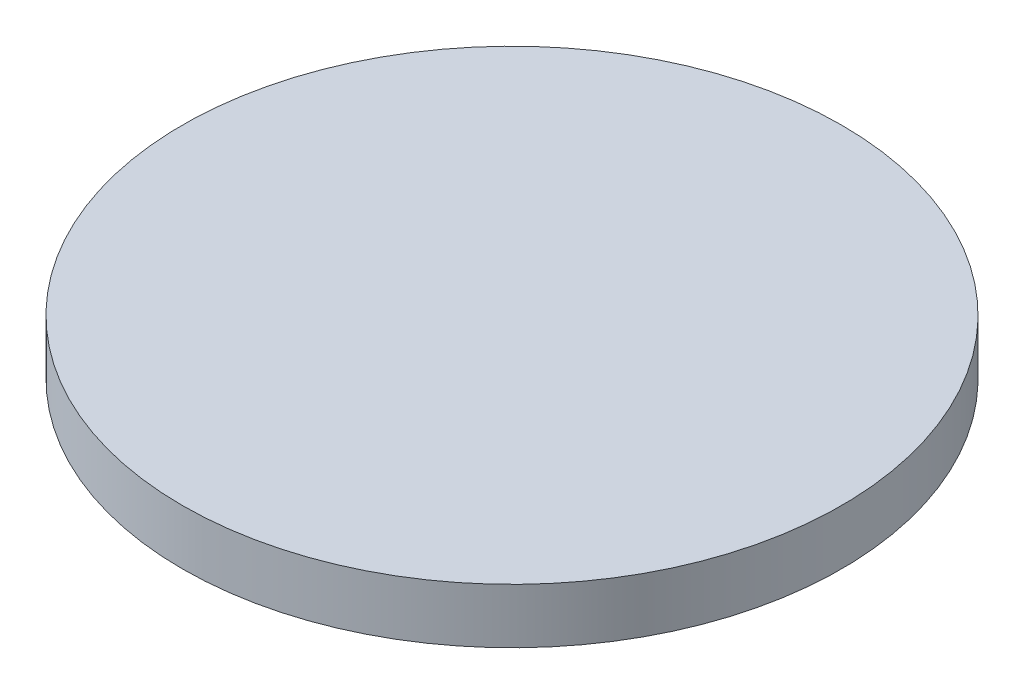
ISO-10303-21;
HEADER;
FILE_DESCRIPTION(('STEP AP214'),'2;1');
FILE_NAME('part.step','',(''),(''),'','','');
FILE_SCHEMA(('AUTOMOTIVE_DESIGN { 1 0 10303 214 1 1 1 1 }'));
ENDSEC;
DATA;
#1=APPLICATION_CONTEXT('core data for automotive mechanical design processes');
#2=APPLICATION_PROTOCOL_DEFINITION('international standard','automotive_design',2000,#1);
#3=PRODUCT_CONTEXT('',#1,'mechanical');
#4=PRODUCT('Part','Part','',(#3));
#5=PRODUCT_RELATED_PRODUCT_CATEGORY('part','',(#4));
#6=PRODUCT_DEFINITION_FORMATION('','',#4);
#7=PRODUCT_DEFINITION_CONTEXT('part definition',#1,'design');
#8=PRODUCT_DEFINITION('design','',#6,#7);
#9=PRODUCT_DEFINITION_SHAPE('','',#8);
#10=(LENGTH_UNIT() NAMED_UNIT(*) SI_UNIT(.MILLI.,.METRE.));
#11=(NAMED_UNIT(*) PLANE_ANGLE_UNIT() SI_UNIT($,.RADIAN.));
#12=(NAMED_UNIT(*) SI_UNIT($,.STERADIAN.) SOLID_ANGLE_UNIT());
#13=UNCERTAINTY_MEASURE_WITH_UNIT(LENGTH_MEASURE(1.E-05),#10,'distance_accuracy_value','');
#14=(GEOMETRIC_REPRESENTATION_CONTEXT(3) GLOBAL_UNCERTAINTY_ASSIGNED_CONTEXT((#13)) GLOBAL_UNIT_ASSIGNED_CONTEXT((#10,
#11,#12)) REPRESENTATION_CONTEXT('',''));
#15=CARTESIAN_POINT('',(0.,0.,0.));
#16=DIRECTION('',(0.,0.,1.));
#17=DIRECTION('',(1.,0.,0.));
#18=AXIS2_PLACEMENT_3D('',#15,#16,#17);
#19=CARTESIAN_POINT('',(0.,5.,0.));
#20=DIRECTION('',(0.,-1.,0.));
#21=DIRECTION('',(0.,0.,-1.));
#22=AXIS2_PLACEMENT_3D('',#19,#20,#21);
#23=CYLINDRICAL_SURFACE('',#22,30.);
#24=CARTESIAN_POINT('',(0.,5.,0.));
#25=DIRECTION('',(0.,1.,0.));
#26=DIRECTION('',(0.,0.,1.));
#27=AXIS2_PLACEMENT_3D('',#24,#25,#26);
#28=CIRCLE('',#27,30.);
#29=CARTESIAN_POINT('',(0.,5.,30.));
#30=VERTEX_POINT('',#29);
#31=EDGE_CURVE('E10',#30,#30,#28,.T.);
#32=ORIENTED_EDGE('',*,*,#31,.F.);
#33=EDGE_LOOP('',(#32));
#34=FACE_BOUND('',#33,.T.);
#35=CARTESIAN_POINT('',(0.,0.,0.));
#36=DIRECTION('',(0.,1.,0.));
#37=DIRECTION('',(0.,0.,1.));
#38=AXIS2_PLACEMENT_3D('',#35,#36,#37);
#39=CIRCLE('',#38,30.);
#40=CARTESIAN_POINT('',(0.,0.,30.));
#41=VERTEX_POINT('',#40);
#42=EDGE_CURVE('E37',#41,#41,#39,.T.);
#43=ORIENTED_EDGE('',*,*,#42,.T.);
#44=EDGE_LOOP('',(#43));
#45=FACE_BOUND('',#44,.T.);
#46=ADVANCED_FACE('F40',(#34,#45),#23,.T.);
#47=CARTESIAN_POINT('',(0.,5.,0.));
#48=DIRECTION('',(0.,1.,0.));
#49=DIRECTION('',(0.,0.,1.));
#50=AXIS2_PLACEMENT_3D('',#47,#48,#49);
#51=PLANE('',#50);
#52=ORIENTED_EDGE('',*,*,#31,.T.);
#53=EDGE_LOOP('',(#52));
#54=FACE_BOUND('',#53,.T.);
#55=ADVANCED_FACE('F55',(#54),#51,.T.);
#56=CARTESIAN_POINT('',(0.,0.,0.));
#57=DIRECTION('',(0.,1.,0.));
#58=DIRECTION('',(0.,0.,1.));
#59=AXIS2_PLACEMENT_3D('',#56,#57,#58);
#60=PLANE('',#59);
#61=ORIENTED_EDGE('',*,*,#42,.F.);
#62=EDGE_LOOP('',(#61));
#63=FACE_BOUND('',#62,.T.);
#64=ADVANCED_FACE('F49',(#63),#60,.F.);
#65=CLOSED_SHELL('',(#46,#55,#64));
#66=MANIFOLD_SOLID_BREP('B2',#65);
#67=ADVANCED_BREP_SHAPE_REPRESENTATION('',(#18,#66),#14);
#68=SHAPE_DEFINITION_REPRESENTATION(#9,#67);
ENDSEC;
END-ISO-10303-21;
